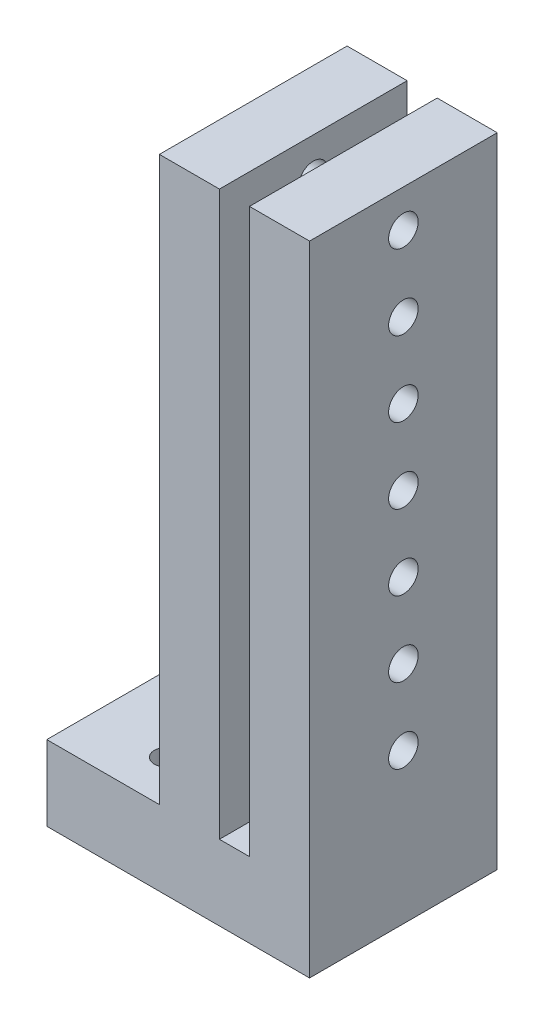
ISO-10303-21;
HEADER;
FILE_DESCRIPTION(('STEP AP214'),'2;1');
FILE_NAME('part.step','',(''),(''),'','','');
FILE_SCHEMA(('AUTOMOTIVE_DESIGN { 1 0 10303 214 1 1 1 1 }'));
ENDSEC;
DATA;
#1=APPLICATION_CONTEXT('core data for automotive mechanical design processes');
#2=APPLICATION_PROTOCOL_DEFINITION('international standard','automotive_design',2000,#1);
#3=PRODUCT_CONTEXT('',#1,'mechanical');
#4=PRODUCT('Part','Part','',(#3));
#5=PRODUCT_RELATED_PRODUCT_CATEGORY('part','',(#4));
#6=PRODUCT_DEFINITION_FORMATION('','',#4);
#7=PRODUCT_DEFINITION_CONTEXT('part definition',#1,'design');
#8=PRODUCT_DEFINITION('design','',#6,#7);
#9=PRODUCT_DEFINITION_SHAPE('','',#8);
#10=(LENGTH_UNIT() NAMED_UNIT(*) SI_UNIT(.MILLI.,.METRE.));
#11=(NAMED_UNIT(*) PLANE_ANGLE_UNIT() SI_UNIT($,.RADIAN.));
#12=(NAMED_UNIT(*) SI_UNIT($,.STERADIAN.) SOLID_ANGLE_UNIT());
#13=UNCERTAINTY_MEASURE_WITH_UNIT(LENGTH_MEASURE(1.E-05),#10,'distance_accuracy_value','');
#14=(GEOMETRIC_REPRESENTATION_CONTEXT(3) GLOBAL_UNCERTAINTY_ASSIGNED_CONTEXT((#13)) GLOBAL_UNIT_ASSIGNED_CONTEXT((#10,
#11,#12)) REPRESENTATION_CONTEXT('',''));
#15=CARTESIAN_POINT('',(0.,0.,0.));
#16=DIRECTION('',(0.,0.,1.));
#17=DIRECTION('',(1.,0.,0.));
#18=AXIS2_PLACEMENT_3D('',#15,#16,#17);
#19=CARTESIAN_POINT('',(50.,20.,-12.5));
#20=DIRECTION('',(-1.,0.,0.));
#21=DIRECTION('',(0.,0.,1.));
#22=AXIS2_PLACEMENT_3D('',#19,#20,#21);
#23=CYLINDRICAL_SURFACE('',#22,1.9669550215581);
#24=CARTESIAN_POINT('',(15.,20.,-12.5));
#25=DIRECTION('',(-1.,0.,0.));
#26=DIRECTION('',(0.,0.,1.));
#27=AXIS2_PLACEMENT_3D('',#24,#25,#26);
#28=CIRCLE('',#27,1.9669550215581);
#29=CARTESIAN_POINT('',(15.,20.,-10.5330449784419));
#30=VERTEX_POINT('',#29);
#31=EDGE_CURVE('E47',#30,#30,#28,.T.);
#32=ORIENTED_EDGE('',*,*,#31,.T.);
#33=EDGE_LOOP('',(#32));
#34=FACE_BOUND('',#33,.T.);
#35=CARTESIAN_POINT('',(23.,20.,-12.5));
#36=DIRECTION('',(-1.,0.,0.));
#37=DIRECTION('',(0.,0.,1.));
#38=AXIS2_PLACEMENT_3D('',#35,#36,#37);
#39=CIRCLE('',#38,1.9669550215581);
#40=CARTESIAN_POINT('',(23.,20.,-10.5330449784419));
#41=VERTEX_POINT('',#40);
#42=EDGE_CURVE('E11',#41,#41,#39,.T.);
#43=ORIENTED_EDGE('',*,*,#42,.F.);
#44=EDGE_LOOP('',(#43));
#45=FACE_BOUND('',#44,.T.);
#46=ADVANCED_FACE('F39',(#34,#45),#23,.F.);
#47=CARTESIAN_POINT('',(50.,30.,-12.5));
#48=DIRECTION('',(-1.,0.,0.));
#49=DIRECTION('',(0.,0.,1.));
#50=AXIS2_PLACEMENT_3D('',#47,#48,#49);
#51=CYLINDRICAL_SURFACE('',#50,1.9669550215581);
#52=CARTESIAN_POINT('',(15.,30.,-12.5));
#53=DIRECTION('',(-1.,0.,0.));
#54=DIRECTION('',(0.,0.,1.));
#55=AXIS2_PLACEMENT_3D('',#52,#53,#54);
#56=CIRCLE('',#55,1.9669550215581);
#57=CARTESIAN_POINT('',(15.,30.,-10.5330449784419));
#58=VERTEX_POINT('',#57);
#59=EDGE_CURVE('E237',#58,#58,#56,.T.);
#60=ORIENTED_EDGE('',*,*,#59,.T.);
#61=EDGE_LOOP('',(#60));
#62=FACE_BOUND('',#61,.T.);
#63=CARTESIAN_POINT('',(23.,30.,-12.5));
#64=DIRECTION('',(-1.,0.,0.));
#65=DIRECTION('',(0.,0.,1.));
#66=AXIS2_PLACEMENT_3D('',#63,#64,#65);
#67=CIRCLE('',#66,1.9669550215581);
#68=CARTESIAN_POINT('',(23.,30.,-10.5330449784419));
#69=VERTEX_POINT('',#68);
#70=EDGE_CURVE('E241',#69,#69,#67,.T.);
#71=ORIENTED_EDGE('',*,*,#70,.F.);
#72=EDGE_LOOP('',(#71));
#73=FACE_BOUND('',#72,.T.);
#74=ADVANCED_FACE('F267',(#62,#73),#51,.F.);
#75=CARTESIAN_POINT('',(50.,40.,-12.5));
#76=DIRECTION('',(-1.,0.,0.));
#77=DIRECTION('',(0.,0.,1.));
#78=AXIS2_PLACEMENT_3D('',#75,#76,#77);
#79=CYLINDRICAL_SURFACE('',#78,1.9669550215581);
#80=CARTESIAN_POINT('',(15.,40.,-12.5));
#81=DIRECTION('',(-1.,0.,0.));
#82=DIRECTION('',(0.,0.,1.));
#83=AXIS2_PLACEMENT_3D('',#80,#81,#82);
#84=CIRCLE('',#83,1.9669550215581);
#85=CARTESIAN_POINT('',(15.,40.,-10.5330449784419));
#86=VERTEX_POINT('',#85);
#87=EDGE_CURVE('E229',#86,#86,#84,.T.);
#88=ORIENTED_EDGE('',*,*,#87,.T.);
#89=EDGE_LOOP('',(#88));
#90=FACE_BOUND('',#89,.T.);
#91=CARTESIAN_POINT('',(23.,40.,-12.5));
#92=DIRECTION('',(-1.,0.,0.));
#93=DIRECTION('',(0.,0.,1.));
#94=AXIS2_PLACEMENT_3D('',#91,#92,#93);
#95=CIRCLE('',#94,1.9669550215581);
#96=CARTESIAN_POINT('',(23.,40.,-10.5330449784419));
#97=VERTEX_POINT('',#96);
#98=EDGE_CURVE('E233',#97,#97,#95,.T.);
#99=ORIENTED_EDGE('',*,*,#98,.F.);
#100=EDGE_LOOP('',(#99));
#101=FACE_BOUND('',#100,.T.);
#102=ADVANCED_FACE('F271',(#90,#101),#79,.F.);
#103=CARTESIAN_POINT('',(50.,50.,-12.5));
#104=DIRECTION('',(-1.,0.,0.));
#105=DIRECTION('',(0.,0.,1.));
#106=AXIS2_PLACEMENT_3D('',#103,#104,#105);
#107=CYLINDRICAL_SURFACE('',#106,1.9669550215581);
#108=CARTESIAN_POINT('',(15.,50.,-12.5));
#109=DIRECTION('',(-1.,0.,0.));
#110=DIRECTION('',(0.,0.,1.));
#111=AXIS2_PLACEMENT_3D('',#108,#109,#110);
#112=CIRCLE('',#111,1.9669550215581);
#113=CARTESIAN_POINT('',(15.,50.,-10.5330449784419));
#114=VERTEX_POINT('',#113);
#115=EDGE_CURVE('E221',#114,#114,#112,.T.);
#116=ORIENTED_EDGE('',*,*,#115,.T.);
#117=EDGE_LOOP('',(#116));
#118=FACE_BOUND('',#117,.T.);
#119=CARTESIAN_POINT('',(23.,50.,-12.5));
#120=DIRECTION('',(-1.,0.,0.));
#121=DIRECTION('',(0.,0.,1.));
#122=AXIS2_PLACEMENT_3D('',#119,#120,#121);
#123=CIRCLE('',#122,1.9669550215581);
#124=CARTESIAN_POINT('',(23.,50.,-10.5330449784419));
#125=VERTEX_POINT('',#124);
#126=EDGE_CURVE('E225',#125,#125,#123,.T.);
#127=ORIENTED_EDGE('',*,*,#126,.F.);
#128=EDGE_LOOP('',(#127));
#129=FACE_BOUND('',#128,.T.);
#130=ADVANCED_FACE('F276',(#118,#129),#107,.F.);
#131=CARTESIAN_POINT('',(50.,60.,-12.5));
#132=DIRECTION('',(-1.,0.,0.));
#133=DIRECTION('',(0.,0.,1.));
#134=AXIS2_PLACEMENT_3D('',#131,#132,#133);
#135=CYLINDRICAL_SURFACE('',#134,1.9669550215581);
#136=CARTESIAN_POINT('',(15.,60.,-12.5));
#137=DIRECTION('',(-1.,0.,0.));
#138=DIRECTION('',(0.,0.,1.));
#139=AXIS2_PLACEMENT_3D('',#136,#137,#138);
#140=CIRCLE('',#139,1.9669550215581);
#141=CARTESIAN_POINT('',(15.,60.,-10.5330449784419));
#142=VERTEX_POINT('',#141);
#143=EDGE_CURVE('E213',#142,#142,#140,.T.);
#144=ORIENTED_EDGE('',*,*,#143,.T.);
#145=EDGE_LOOP('',(#144));
#146=FACE_BOUND('',#145,.T.);
#147=CARTESIAN_POINT('',(23.,60.,-12.5));
#148=DIRECTION('',(-1.,0.,0.));
#149=DIRECTION('',(0.,0.,1.));
#150=AXIS2_PLACEMENT_3D('',#147,#148,#149);
#151=CIRCLE('',#150,1.9669550215581);
#152=CARTESIAN_POINT('',(23.,60.,-10.5330449784419));
#153=VERTEX_POINT('',#152);
#154=EDGE_CURVE('E217',#153,#153,#151,.T.);
#155=ORIENTED_EDGE('',*,*,#154,.F.);
#156=EDGE_LOOP('',(#155));
#157=FACE_BOUND('',#156,.T.);
#158=ADVANCED_FACE('F283',(#146,#157),#135,.F.);
#159=CARTESIAN_POINT('',(50.,20.,-12.5));
#160=DIRECTION('',(-1.,0.,0.));
#161=DIRECTION('',(0.,0.,1.));
#162=AXIS2_PLACEMENT_3D('',#159,#160,#161);
#163=CYLINDRICAL_SURFACE('',#162,1.9669550215581);
#164=CARTESIAN_POINT('',(27.,20.,-12.5));
#165=DIRECTION('',(1.,0.,0.));
#166=DIRECTION('',(0.,0.,-1.));
#167=AXIS2_PLACEMENT_3D('',#164,#165,#166);
#168=CIRCLE('',#167,1.9669550215581);
#169=CARTESIAN_POINT('',(27.,20.,-14.4669550215581));
#170=VERTEX_POINT('',#169);
#171=EDGE_CURVE('E205',#170,#170,#168,.T.);
#172=ORIENTED_EDGE('',*,*,#171,.F.);
#173=EDGE_LOOP('',(#172));
#174=FACE_BOUND('',#173,.T.);
#175=CARTESIAN_POINT('',(35.,20.,-12.5));
#176=DIRECTION('',(-1.,0.,0.));
#177=DIRECTION('',(0.,0.,1.));
#178=AXIS2_PLACEMENT_3D('',#175,#176,#177);
#179=CIRCLE('',#178,1.9669550215581);
#180=CARTESIAN_POINT('',(35.,20.,-10.5330449784419));
#181=VERTEX_POINT('',#180);
#182=EDGE_CURVE('E209',#181,#181,#179,.T.);
#183=ORIENTED_EDGE('',*,*,#182,.F.);
#184=EDGE_LOOP('',(#183));
#185=FACE_BOUND('',#184,.T.);
#186=ADVANCED_FACE('F287',(#174,#185),#163,.F.);
#187=CARTESIAN_POINT('',(50.,30.,-12.5));
#188=DIRECTION('',(-1.,0.,0.));
#189=DIRECTION('',(0.,0.,1.));
#190=AXIS2_PLACEMENT_3D('',#187,#188,#189);
#191=CYLINDRICAL_SURFACE('',#190,1.9669550215581);
#192=CARTESIAN_POINT('',(27.,30.,-12.5));
#193=DIRECTION('',(1.,0.,0.));
#194=DIRECTION('',(0.,0.,-1.));
#195=AXIS2_PLACEMENT_3D('',#192,#193,#194);
#196=CIRCLE('',#195,1.9669550215581);
#197=CARTESIAN_POINT('',(27.,30.,-14.4669550215581));
#198=VERTEX_POINT('',#197);
#199=EDGE_CURVE('E197',#198,#198,#196,.T.);
#200=ORIENTED_EDGE('',*,*,#199,.F.);
#201=EDGE_LOOP('',(#200));
#202=FACE_BOUND('',#201,.T.);
#203=CARTESIAN_POINT('',(35.,30.,-12.5));
#204=DIRECTION('',(-1.,0.,0.));
#205=DIRECTION('',(0.,0.,1.));
#206=AXIS2_PLACEMENT_3D('',#203,#204,#205);
#207=CIRCLE('',#206,1.9669550215581);
#208=CARTESIAN_POINT('',(35.,30.,-10.5330449784419));
#209=VERTEX_POINT('',#208);
#210=EDGE_CURVE('E201',#209,#209,#207,.T.);
#211=ORIENTED_EDGE('',*,*,#210,.F.);
#212=EDGE_LOOP('',(#211));
#213=FACE_BOUND('',#212,.T.);
#214=ADVANCED_FACE('F291',(#202,#213),#191,.F.);
#215=CARTESIAN_POINT('',(50.,40.,-12.5));
#216=DIRECTION('',(-1.,0.,0.));
#217=DIRECTION('',(0.,0.,1.));
#218=AXIS2_PLACEMENT_3D('',#215,#216,#217);
#219=CYLINDRICAL_SURFACE('',#218,1.9669550215581);
#220=CARTESIAN_POINT('',(27.,40.,-12.5));
#221=DIRECTION('',(1.,0.,0.));
#222=DIRECTION('',(0.,0.,-1.));
#223=AXIS2_PLACEMENT_3D('',#220,#221,#222);
#224=CIRCLE('',#223,1.9669550215581);
#225=CARTESIAN_POINT('',(27.,40.,-14.4669550215581));
#226=VERTEX_POINT('',#225);
#227=EDGE_CURVE('E189',#226,#226,#224,.T.);
#228=ORIENTED_EDGE('',*,*,#227,.F.);
#229=EDGE_LOOP('',(#228));
#230=FACE_BOUND('',#229,.T.);
#231=CARTESIAN_POINT('',(35.,40.,-12.5));
#232=DIRECTION('',(-1.,0.,0.));
#233=DIRECTION('',(0.,0.,1.));
#234=AXIS2_PLACEMENT_3D('',#231,#232,#233);
#235=CIRCLE('',#234,1.9669550215581);
#236=CARTESIAN_POINT('',(35.,40.,-10.5330449784419));
#237=VERTEX_POINT('',#236);
#238=EDGE_CURVE('E193',#237,#237,#235,.T.);
#239=ORIENTED_EDGE('',*,*,#238,.F.);
#240=EDGE_LOOP('',(#239));
#241=FACE_BOUND('',#240,.T.);
#242=ADVANCED_FACE('F295',(#230,#241),#219,.F.);
#243=CARTESIAN_POINT('',(50.,50.,-12.5));
#244=DIRECTION('',(-1.,0.,0.));
#245=DIRECTION('',(0.,0.,1.));
#246=AXIS2_PLACEMENT_3D('',#243,#244,#245);
#247=CYLINDRICAL_SURFACE('',#246,1.9669550215581);
#248=CARTESIAN_POINT('',(27.,50.,-12.5));
#249=DIRECTION('',(1.,0.,0.));
#250=DIRECTION('',(0.,0.,-1.));
#251=AXIS2_PLACEMENT_3D('',#248,#249,#250);
#252=CIRCLE('',#251,1.9669550215581);
#253=CARTESIAN_POINT('',(27.,50.,-14.4669550215581));
#254=VERTEX_POINT('',#253);
#255=EDGE_CURVE('E181',#254,#254,#252,.T.);
#256=ORIENTED_EDGE('',*,*,#255,.F.);
#257=EDGE_LOOP('',(#256));
#258=FACE_BOUND('',#257,.T.);
#259=CARTESIAN_POINT('',(35.,50.,-12.5));
#260=DIRECTION('',(-1.,0.,0.));
#261=DIRECTION('',(0.,0.,1.));
#262=AXIS2_PLACEMENT_3D('',#259,#260,#261);
#263=CIRCLE('',#262,1.9669550215581);
#264=CARTESIAN_POINT('',(35.,50.,-10.5330449784419));
#265=VERTEX_POINT('',#264);
#266=EDGE_CURVE('E185',#265,#265,#263,.T.);
#267=ORIENTED_EDGE('',*,*,#266,.F.);
#268=EDGE_LOOP('',(#267));
#269=FACE_BOUND('',#268,.T.);
#270=ADVANCED_FACE('F299',(#258,#269),#247,.F.);
#271=CARTESIAN_POINT('',(50.,60.,-12.5));
#272=DIRECTION('',(-1.,0.,0.));
#273=DIRECTION('',(0.,0.,1.));
#274=AXIS2_PLACEMENT_3D('',#271,#272,#273);
#275=CYLINDRICAL_SURFACE('',#274,1.9669550215581);
#276=CARTESIAN_POINT('',(27.,60.,-12.5));
#277=DIRECTION('',(1.,0.,0.));
#278=DIRECTION('',(0.,0.,-1.));
#279=AXIS2_PLACEMENT_3D('',#276,#277,#278);
#280=CIRCLE('',#279,1.9669550215581);
#281=CARTESIAN_POINT('',(27.,60.,-14.4669550215581));
#282=VERTEX_POINT('',#281);
#283=EDGE_CURVE('E167',#282,#282,#280,.T.);
#284=ORIENTED_EDGE('',*,*,#283,.F.);
#285=EDGE_LOOP('',(#284));
#286=FACE_BOUND('',#285,.T.);
#287=CARTESIAN_POINT('',(35.,60.,-12.5));
#288=DIRECTION('',(-1.,0.,0.));
#289=DIRECTION('',(0.,0.,1.));
#290=AXIS2_PLACEMENT_3D('',#287,#288,#289);
#291=CIRCLE('',#290,1.9669550215581);
#292=CARTESIAN_POINT('',(35.,60.,-10.5330449784419));
#293=VERTEX_POINT('',#292);
#294=EDGE_CURVE('E177',#293,#293,#291,.T.);
#295=ORIENTED_EDGE('',*,*,#294,.F.);
#296=EDGE_LOOP('',(#295));
#297=FACE_BOUND('',#296,.T.);
#298=ADVANCED_FACE('F303',(#286,#297),#275,.F.);
#299=CARTESIAN_POINT('',(0.,85.,0.));
#300=DIRECTION('',(0.,1.,0.));
#301=DIRECTION('',(0.,0.,1.));
#302=AXIS2_PLACEMENT_3D('',#299,#300,#301);
#303=PLANE('',#302);
#304=DIRECTION('',(0.,0.,-1.));
#305=VECTOR('',#304,1.);
#306=CARTESIAN_POINT('',(27.,85.,-25.));
#307=LINE('',#306,#305);
#308=CARTESIAN_POINT('',(27.,85.,0.));
#309=VERTEX_POINT('',#308);
#310=CARTESIAN_POINT('',(27.,85.,-25.));
#311=VERTEX_POINT('',#310);
#312=EDGE_CURVE('E367',#309,#311,#307,.T.);
#313=ORIENTED_EDGE('',*,*,#312,.F.);
#314=DIRECTION('',(1.,0.,0.));
#315=VECTOR('',#314,1.);
#316=CARTESIAN_POINT('',(15.,85.,0.));
#317=LINE('',#316,#315);
#318=CARTESIAN_POINT('',(35.,85.,0.));
#319=VERTEX_POINT('',#318);
#320=EDGE_CURVE('E403',#309,#319,#317,.T.);
#321=ORIENTED_EDGE('',*,*,#320,.T.);
#322=DIRECTION('',(0.,0.,-1.));
#323=VECTOR('',#322,1.);
#324=CARTESIAN_POINT('',(35.,85.,-25.));
#325=LINE('',#324,#323);
#326=CARTESIAN_POINT('',(35.,85.,-25.));
#327=VERTEX_POINT('',#326);
#328=EDGE_CURVE('E408',#319,#327,#325,.T.);
#329=ORIENTED_EDGE('',*,*,#328,.T.);
#330=DIRECTION('',(-1.,0.,0.));
#331=VECTOR('',#330,1.);
#332=CARTESIAN_POINT('',(15.,85.,-25.));
#333=LINE('',#332,#331);
#334=EDGE_CURVE('E125',#327,#311,#333,.T.);
#335=ORIENTED_EDGE('',*,*,#334,.T.);
#336=EDGE_LOOP('',(#313,#321,#329,#335));
#337=FACE_BOUND('',#336,.T.);
#338=ADVANCED_FACE('F307',(#337),#303,.T.);
#339=CARTESIAN_POINT('',(0.,10.,0.));
#340=DIRECTION('',(0.,-1.,0.));
#341=DIRECTION('',(0.,0.,-1.));
#342=AXIS2_PLACEMENT_3D('',#339,#340,#341);
#343=PLANE('',#342);
#344=CARTESIAN_POINT('',(10.0004400064535,9.99999999999999,-5.93063091270837));
#345=DIRECTION('',(0.,-1.,0.));
#346=DIRECTION('',(0.,0.,-1.));
#347=AXIS2_PLACEMENT_3D('',#344,#345,#346);
#348=CIRCLE('',#347,1.6);
#349=CARTESIAN_POINT('',(10.0004400064535,9.99999999999999,-7.53063091270837));
#350=VERTEX_POINT('',#349);
#351=EDGE_CURVE('E329',#350,#350,#348,.F.);
#352=ORIENTED_EDGE('',*,*,#351,.F.);
#353=EDGE_LOOP('',(#352));
#354=FACE_BOUND('',#353,.T.);
#355=CARTESIAN_POINT('',(10.0004400064535,9.99999999999999,-19.0693690872916));
#356=DIRECTION('',(0.,-1.,0.));
#357=DIRECTION('',(0.,0.,-1.));
#358=AXIS2_PLACEMENT_3D('',#355,#356,#357);
#359=CIRCLE('',#358,1.6);
#360=CARTESIAN_POINT('',(10.0004400064535,9.99999999999999,-20.6693690872916));
#361=VERTEX_POINT('',#360);
#362=EDGE_CURVE('E141',#361,#361,#359,.T.);
#363=ORIENTED_EDGE('',*,*,#362,.T.);
#364=EDGE_LOOP('',(#363));
#365=FACE_BOUND('',#364,.T.);
#366=DIRECTION('',(0.,0.,1.));
#367=VECTOR('',#366,1.);
#368=CARTESIAN_POINT('',(15.,10.,-25.));
#369=LINE('',#368,#367);
#370=CARTESIAN_POINT('',(15.,10.,-25.));
#371=VERTEX_POINT('',#370);
#372=CARTESIAN_POINT('',(15.,10.,0.));
#373=VERTEX_POINT('',#372);
#374=EDGE_CURVE('E62',#371,#373,#369,.T.);
#375=ORIENTED_EDGE('',*,*,#374,.F.);
#376=DIRECTION('',(-1.,0.,0.));
#377=VECTOR('',#376,1.);
#378=CARTESIAN_POINT('',(0.,10.,-25.));
#379=LINE('',#378,#377);
#380=CARTESIAN_POINT('',(0.,10.,-25.));
#381=VERTEX_POINT('',#380);
#382=EDGE_CURVE('E163',#371,#381,#379,.T.);
#383=ORIENTED_EDGE('',*,*,#382,.T.);
#384=DIRECTION('',(0.,0.,1.));
#385=VECTOR('',#384,1.);
#386=CARTESIAN_POINT('',(0.,10.,0.));
#387=LINE('',#386,#385);
#388=CARTESIAN_POINT('',(0.,10.,0.));
#389=VERTEX_POINT('',#388);
#390=EDGE_CURVE('E148',#381,#389,#387,.T.);
#391=ORIENTED_EDGE('',*,*,#390,.T.);
#392=DIRECTION('',(1.,0.,0.));
#393=VECTOR('',#392,1.);
#394=CARTESIAN_POINT('',(0.,10.,0.));
#395=LINE('',#394,#393);
#396=EDGE_CURVE('E154',#389,#373,#395,.T.);
#397=ORIENTED_EDGE('',*,*,#396,.T.);
#398=EDGE_LOOP('',(#375,#383,#391,#397));
#399=FACE_BOUND('',#398,.T.);
#400=ADVANCED_FACE('F313',(#354,#365,#399),#343,.F.);
#401=CARTESIAN_POINT('',(0.,10.,0.));
#402=DIRECTION('',(1.,0.,0.));
#403=DIRECTION('',(0.,0.,-1.));
#404=AXIS2_PLACEMENT_3D('',#401,#402,#403);
#405=PLANE('',#404);
#406=DIRECTION('',(0.,0.,1.));
#407=VECTOR('',#406,1.);
#408=CARTESIAN_POINT('',(0.,0.,0.));
#409=LINE('',#408,#407);
#410=CARTESIAN_POINT('',(0.,0.,-25.));
#411=VERTEX_POINT('',#410);
#412=CARTESIAN_POINT('',(0.,0.,0.));
#413=VERTEX_POINT('',#412);
#414=EDGE_CURVE('E146',#411,#413,#409,.T.);
#415=ORIENTED_EDGE('',*,*,#414,.T.);
#416=DIRECTION('',(0.,-1.,0.));
#417=VECTOR('',#416,1.);
#418=CARTESIAN_POINT('',(0.,10.,0.));
#419=LINE('',#418,#417);
#420=EDGE_CURVE('E162',#389,#413,#419,.T.);
#421=ORIENTED_EDGE('',*,*,#420,.F.);
#422=ORIENTED_EDGE('',*,*,#390,.F.);
#423=DIRECTION('',(0.,-1.,0.));
#424=VECTOR('',#423,1.);
#425=CARTESIAN_POINT('',(0.,10.,-25.));
#426=LINE('',#425,#424);
#427=EDGE_CURVE('E159',#381,#411,#426,.T.);
#428=ORIENTED_EDGE('',*,*,#427,.T.);
#429=EDGE_LOOP('',(#415,#421,#422,#428));
#430=FACE_BOUND('',#429,.T.);
#431=ADVANCED_FACE('F309',(#430),#405,.F.);
#432=CARTESIAN_POINT('',(0.,10.,0.));
#433=DIRECTION('',(0.,0.,-1.));
#434=DIRECTION('',(-1.,0.,0.));
#435=AXIS2_PLACEMENT_3D('',#432,#433,#434);
#436=PLANE('',#435);
#437=DIRECTION('',(1.,0.,0.));
#438=VECTOR('',#437,1.);
#439=CARTESIAN_POINT('',(0.,0.,0.));
#440=LINE('',#439,#438);
#441=CARTESIAN_POINT('',(35.,0.,0.));
#442=VERTEX_POINT('',#441);
#443=EDGE_CURVE('E149',#413,#442,#440,.T.);
#444=ORIENTED_EDGE('',*,*,#443,.T.);
#445=DIRECTION('',(0.,-1.,0.));
#446=VECTOR('',#445,1.);
#447=CARTESIAN_POINT('',(35.,85.,0.));
#448=LINE('',#447,#446);
#449=EDGE_CURVE('E129',#319,#442,#448,.T.);
#450=ORIENTED_EDGE('',*,*,#449,.F.);
#451=ORIENTED_EDGE('',*,*,#320,.F.);
#452=DIRECTION('',(0.,1.,0.));
#453=VECTOR('',#452,1.);
#454=CARTESIAN_POINT('',(27.,-15.3179778023443,0.));
#455=LINE('',#454,#453);
#456=CARTESIAN_POINT('',(27.,10.,0.));
#457=VERTEX_POINT('',#456);
#458=EDGE_CURVE('E376',#457,#309,#455,.T.);
#459=ORIENTED_EDGE('',*,*,#458,.F.);
#460=DIRECTION('',(1.,0.,0.));
#461=VECTOR('',#460,1.);
#462=CARTESIAN_POINT('',(23.,10.,0.));
#463=LINE('',#462,#461);
#464=CARTESIAN_POINT('',(23.,10.,0.));
#465=VERTEX_POINT('',#464);
#466=EDGE_CURVE('E370',#465,#457,#463,.T.);
#467=ORIENTED_EDGE('',*,*,#466,.F.);
#468=DIRECTION('',(0.,1.,0.));
#469=VECTOR('',#468,1.);
#470=CARTESIAN_POINT('',(23.,-15.3179778023443,0.));
#471=LINE('',#470,#469);
#472=CARTESIAN_POINT('',(23.,85.,0.));
#473=VERTEX_POINT('',#472);
#474=EDGE_CURVE('E380',#465,#473,#471,.T.);
#475=ORIENTED_EDGE('',*,*,#474,.T.);
#476=CARTESIAN_POINT('',(15.,85.,0.));
#477=VERTEX_POINT('',#476);
#478=EDGE_CURVE('E404',#477,#473,#317,.T.);
#479=ORIENTED_EDGE('',*,*,#478,.F.);
#480=DIRECTION('',(0.,-1.,0.));
#481=VECTOR('',#480,1.);
#482=CARTESIAN_POINT('',(15.,85.,0.));
#483=LINE('',#482,#481);
#484=EDGE_CURVE('E421',#477,#373,#483,.T.);
#485=ORIENTED_EDGE('',*,*,#484,.T.);
#486=ORIENTED_EDGE('',*,*,#396,.F.);
#487=ORIENTED_EDGE('',*,*,#420,.T.);
#488=EDGE_LOOP('',(#444,#450,#451,#459,#467,#475,#479,#485,#486,#487));
#489=FACE_BOUND('',#488,.T.);
#490=ADVANCED_FACE('F312',(#489),#436,.F.);
#491=CARTESIAN_POINT('',(0.,10.,-25.));
#492=DIRECTION('',(0.,0.,1.));
#493=DIRECTION('',(1.,0.,0.));
#494=AXIS2_PLACEMENT_3D('',#491,#492,#493);
#495=PLANE('',#494);
#496=DIRECTION('',(0.,-1.,0.));
#497=VECTOR('',#496,1.);
#498=CARTESIAN_POINT('',(35.,85.,-25.));
#499=LINE('',#498,#497);
#500=CARTESIAN_POINT('',(35.,0.,-25.));
#501=VERTEX_POINT('',#500);
#502=EDGE_CURVE('E116',#327,#501,#499,.T.);
#503=ORIENTED_EDGE('',*,*,#502,.T.);
#504=DIRECTION('',(-1.,0.,0.));
#505=VECTOR('',#504,1.);
#506=CARTESIAN_POINT('',(0.,0.,-25.));
#507=LINE('',#506,#505);
#508=EDGE_CURVE('E121',#501,#411,#507,.T.);
#509=ORIENTED_EDGE('',*,*,#508,.T.);
#510=ORIENTED_EDGE('',*,*,#427,.F.);
#511=ORIENTED_EDGE('',*,*,#382,.F.);
#512=DIRECTION('',(0.,-1.,0.));
#513=VECTOR('',#512,1.);
#514=CARTESIAN_POINT('',(15.,85.,-25.));
#515=LINE('',#514,#513);
#516=CARTESIAN_POINT('',(15.,85.,-25.));
#517=VERTEX_POINT('',#516);
#518=EDGE_CURVE('E130',#517,#371,#515,.T.);
#519=ORIENTED_EDGE('',*,*,#518,.F.);
#520=CARTESIAN_POINT('',(23.,85.,-25.));
#521=VERTEX_POINT('',#520);
#522=EDGE_CURVE('E411',#521,#517,#333,.T.);
#523=ORIENTED_EDGE('',*,*,#522,.F.);
#524=DIRECTION('',(0.,1.,0.));
#525=VECTOR('',#524,1.);
#526=CARTESIAN_POINT('',(23.,-15.3179778023443,-25.));
#527=LINE('',#526,#525);
#528=CARTESIAN_POINT('',(23.,10.,-25.));
#529=VERTEX_POINT('',#528);
#530=EDGE_CURVE('E54',#529,#521,#527,.T.);
#531=ORIENTED_EDGE('',*,*,#530,.F.);
#532=DIRECTION('',(-1.,0.,0.));
#533=VECTOR('',#532,1.);
#534=CARTESIAN_POINT('',(23.,10.,-25.));
#535=LINE('',#534,#533);
#536=CARTESIAN_POINT('',(27.,10.,-25.));
#537=VERTEX_POINT('',#536);
#538=EDGE_CURVE('E381',#537,#529,#535,.T.);
#539=ORIENTED_EDGE('',*,*,#538,.F.);
#540=DIRECTION('',(0.,1.,0.));
#541=VECTOR('',#540,1.);
#542=CARTESIAN_POINT('',(27.,-15.3179778023443,-25.));
#543=LINE('',#542,#541);
#544=EDGE_CURVE('E385',#537,#311,#543,.T.);
#545=ORIENTED_EDGE('',*,*,#544,.T.);
#546=ORIENTED_EDGE('',*,*,#334,.F.);
#547=EDGE_LOOP('',(#503,#509,#510,#511,#519,#523,#531,#539,#545,#546));
#548=FACE_BOUND('',#547,.T.);
#549=ADVANCED_FACE('F118',(#548),#495,.F.);
#550=CARTESIAN_POINT('',(0.,0.,0.));
#551=DIRECTION('',(0.,-1.,0.));
#552=DIRECTION('',(0.,0.,-1.));
#553=AXIS2_PLACEMENT_3D('',#550,#551,#552);
#554=PLANE('',#553);
#555=CARTESIAN_POINT('',(10.0004400064535,0.,-5.93063091270837));
#556=DIRECTION('',(0.,1.,0.));
#557=DIRECTION('',(0.,0.,1.));
#558=AXIS2_PLACEMENT_3D('',#555,#556,#557);
#559=CIRCLE('',#558,1.6);
#560=CARTESIAN_POINT('',(10.0004400064535,0.,-4.33063091270836));
#561=VERTEX_POINT('',#560);
#562=EDGE_CURVE('E662',#561,#561,#559,.T.);
#563=ORIENTED_EDGE('',*,*,#562,.T.);
#564=EDGE_LOOP('',(#563));
#565=FACE_BOUND('',#564,.T.);
#566=CARTESIAN_POINT('',(10.0004400064535,0.,-19.0693690872916));
#567=DIRECTION('',(0.,-1.,0.));
#568=DIRECTION('',(0.,0.,-1.));
#569=AXIS2_PLACEMENT_3D('',#566,#567,#568);
#570=CIRCLE('',#569,1.6);
#571=CARTESIAN_POINT('',(10.0004400064535,0.,-20.6693690872916));
#572=VERTEX_POINT('',#571);
#573=EDGE_CURVE('E334',#572,#572,#570,.T.);
#574=ORIENTED_EDGE('',*,*,#573,.F.);
#575=EDGE_LOOP('',(#574));
#576=FACE_BOUND('',#575,.T.);
#577=DIRECTION('',(0.,0.,1.));
#578=VECTOR('',#577,1.);
#579=CARTESIAN_POINT('',(35.,0.,-25.));
#580=LINE('',#579,#578);
#581=EDGE_CURVE('E133',#501,#442,#580,.T.);
#582=ORIENTED_EDGE('',*,*,#581,.T.);
#583=ORIENTED_EDGE('',*,*,#443,.F.);
#584=ORIENTED_EDGE('',*,*,#414,.F.);
#585=ORIENTED_EDGE('',*,*,#508,.F.);
#586=EDGE_LOOP('',(#582,#583,#584,#585));
#587=FACE_BOUND('',#586,.T.);
#588=ADVANCED_FACE('F144',(#565,#576,#587),#554,.T.);
#589=CARTESIAN_POINT('',(15.,85.,-25.));
#590=DIRECTION('',(1.,0.,0.));
#591=DIRECTION('',(0.,0.,-1.));
#592=AXIS2_PLACEMENT_3D('',#589,#590,#591);
#593=PLANE('',#592);
#594=CARTESIAN_POINT('',(15.,70.,-12.5));
#595=DIRECTION('',(-1.,0.,0.));
#596=DIRECTION('',(0.,0.,1.));
#597=AXIS2_PLACEMENT_3D('',#594,#595,#596);
#598=CIRCLE('',#597,1.9669550215581);
#599=CARTESIAN_POINT('',(15.,70.,-10.5330449784419));
#600=VERTEX_POINT('',#599);
#601=EDGE_CURVE('E140',#600,#600,#598,.T.);
#602=ORIENTED_EDGE('',*,*,#601,.F.);
#603=EDGE_LOOP('',(#602));
#604=FACE_BOUND('',#603,.T.);
#605=CARTESIAN_POINT('',(15.,80.,-12.5));
#606=DIRECTION('',(-1.,0.,0.));
#607=DIRECTION('',(0.,0.,1.));
#608=AXIS2_PLACEMENT_3D('',#605,#606,#607);
#609=CIRCLE('',#608,1.9669550215581);
#610=CARTESIAN_POINT('',(15.,80.,-10.5330449784419));
#611=VERTEX_POINT('',#610);
#612=EDGE_CURVE('E173',#611,#611,#609,.T.);
#613=ORIENTED_EDGE('',*,*,#612,.F.);
#614=EDGE_LOOP('',(#613));
#615=FACE_BOUND('',#614,.T.);
#616=ORIENTED_EDGE('',*,*,#374,.T.);
#617=ORIENTED_EDGE('',*,*,#484,.F.);
#618=DIRECTION('',(0.,0.,1.));
#619=VECTOR('',#618,1.);
#620=CARTESIAN_POINT('',(15.,85.,-25.));
#621=LINE('',#620,#619);
#622=EDGE_CURVE('E399',#517,#477,#621,.T.);
#623=ORIENTED_EDGE('',*,*,#622,.F.);
#624=ORIENTED_EDGE('',*,*,#518,.T.);
#625=EDGE_LOOP('',(#616,#617,#623,#624));
#626=FACE_BOUND('',#625,.T.);
#627=ORIENTED_EDGE('',*,*,#143,.F.);
#628=EDGE_LOOP('',(#627));
#629=FACE_BOUND('',#628,.T.);
#630=ORIENTED_EDGE('',*,*,#115,.F.);
#631=EDGE_LOOP('',(#630));
#632=FACE_BOUND('',#631,.T.);
#633=ORIENTED_EDGE('',*,*,#87,.F.);
#634=EDGE_LOOP('',(#633));
#635=FACE_BOUND('',#634,.T.);
#636=ORIENTED_EDGE('',*,*,#59,.F.);
#637=EDGE_LOOP('',(#636));
#638=FACE_BOUND('',#637,.T.);
#639=ORIENTED_EDGE('',*,*,#31,.F.);
#640=EDGE_LOOP('',(#639));
#641=FACE_BOUND('',#640,.T.);
#642=ADVANCED_FACE('F250',(#604,#615,#626,#629,#632,#635,#638,#641),#593,.F.);
#643=CARTESIAN_POINT('',(35.,85.,-25.));
#644=DIRECTION('',(-1.,0.,0.));
#645=DIRECTION('',(0.,0.,1.));
#646=AXIS2_PLACEMENT_3D('',#643,#644,#645);
#647=PLANE('',#646);
#648=CARTESIAN_POINT('',(35.,70.,-12.5));
#649=DIRECTION('',(-1.,0.,0.));
#650=DIRECTION('',(0.,0.,1.));
#651=AXIS2_PLACEMENT_3D('',#648,#649,#650);
#652=CIRCLE('',#651,1.9669550215581);
#653=CARTESIAN_POINT('',(35.,70.,-10.5330449784419));
#654=VERTEX_POINT('',#653);
#655=EDGE_CURVE('E352',#654,#654,#652,.T.);
#656=ORIENTED_EDGE('',*,*,#655,.T.);
#657=EDGE_LOOP('',(#656));
#658=FACE_BOUND('',#657,.T.);
#659=CARTESIAN_POINT('',(35.,80.,-12.5));
#660=DIRECTION('',(-1.,0.,0.));
#661=DIRECTION('',(0.,0.,1.));
#662=AXIS2_PLACEMENT_3D('',#659,#660,#661);
#663=CIRCLE('',#662,1.9669550215581);
#664=CARTESIAN_POINT('',(35.,80.,-10.5330449784419));
#665=VERTEX_POINT('',#664);
#666=EDGE_CURVE('E362',#665,#665,#663,.T.);
#667=ORIENTED_EDGE('',*,*,#666,.T.);
#668=EDGE_LOOP('',(#667));
#669=FACE_BOUND('',#668,.T.);
#670=ORIENTED_EDGE('',*,*,#449,.T.);
#671=ORIENTED_EDGE('',*,*,#581,.F.);
#672=ORIENTED_EDGE('',*,*,#502,.F.);
#673=ORIENTED_EDGE('',*,*,#328,.F.);
#674=EDGE_LOOP('',(#670,#671,#672,#673));
#675=FACE_BOUND('',#674,.T.);
#676=ORIENTED_EDGE('',*,*,#294,.T.);
#677=EDGE_LOOP('',(#676));
#678=FACE_BOUND('',#677,.T.);
#679=ORIENTED_EDGE('',*,*,#266,.T.);
#680=EDGE_LOOP('',(#679));
#681=FACE_BOUND('',#680,.T.);
#682=ORIENTED_EDGE('',*,*,#238,.T.);
#683=EDGE_LOOP('',(#682));
#684=FACE_BOUND('',#683,.T.);
#685=ORIENTED_EDGE('',*,*,#210,.T.);
#686=EDGE_LOOP('',(#685));
#687=FACE_BOUND('',#686,.T.);
#688=ORIENTED_EDGE('',*,*,#182,.T.);
#689=EDGE_LOOP('',(#688));
#690=FACE_BOUND('',#689,.T.);
#691=ADVANCED_FACE('F134',(#658,#669,#675,#678,#681,#684,#687,#690),#647,.F.);
#692=DIRECTION('',(0.,0.,1.));
#693=VECTOR('',#692,1.);
#694=CARTESIAN_POINT('',(23.,85.,-25.));
#695=LINE('',#694,#693);
#696=EDGE_CURVE('E366',#521,#473,#695,.T.);
#697=ORIENTED_EDGE('',*,*,#696,.F.);
#698=ORIENTED_EDGE('',*,*,#522,.T.);
#699=ORIENTED_EDGE('',*,*,#622,.T.);
#700=ORIENTED_EDGE('',*,*,#478,.T.);
#701=EDGE_LOOP('',(#697,#698,#699,#700));
#702=FACE_BOUND('',#701,.T.);
#703=ADVANCED_FACE('F258',(#702),#303,.T.);
#704=CARTESIAN_POINT('',(0.,10.,0.));
#705=DIRECTION('',(0.,-1.,0.));
#706=DIRECTION('',(0.,0.,-1.));
#707=AXIS2_PLACEMENT_3D('',#704,#705,#706);
#708=PLANE('',#707);
#709=DIRECTION('',(0.,0.,1.));
#710=VECTOR('',#709,1.);
#711=CARTESIAN_POINT('',(23.,10.,-25.));
#712=LINE('',#711,#710);
#713=EDGE_CURVE('E377',#529,#465,#712,.T.);
#714=ORIENTED_EDGE('',*,*,#713,.T.);
#715=ORIENTED_EDGE('',*,*,#466,.T.);
#716=DIRECTION('',(0.,0.,-1.));
#717=VECTOR('',#716,1.);
#718=CARTESIAN_POINT('',(27.,10.,-25.));
#719=LINE('',#718,#717);
#720=EDGE_CURVE('E386',#457,#537,#719,.T.);
#721=ORIENTED_EDGE('',*,*,#720,.T.);
#722=ORIENTED_EDGE('',*,*,#538,.T.);
#723=EDGE_LOOP('',(#714,#715,#721,#722));
#724=FACE_BOUND('',#723,.T.);
#725=ADVANCED_FACE('F449',(#724),#708,.F.);
#726=CARTESIAN_POINT('',(27.,-15.3179778023443,-25.));
#727=DIRECTION('',(1.,0.,0.));
#728=DIRECTION('',(0.,0.,-1.));
#729=AXIS2_PLACEMENT_3D('',#726,#727,#728);
#730=PLANE('',#729);
#731=CARTESIAN_POINT('',(27.,70.,-12.5));
#732=DIRECTION('',(1.,0.,0.));
#733=DIRECTION('',(0.,0.,-1.));
#734=AXIS2_PLACEMENT_3D('',#731,#732,#733);
#735=CIRCLE('',#734,1.9669550215581);
#736=CARTESIAN_POINT('',(27.,70.,-14.4669550215581));
#737=VERTEX_POINT('',#736);
#738=EDGE_CURVE('E348',#737,#737,#735,.T.);
#739=ORIENTED_EDGE('',*,*,#738,.T.);
#740=EDGE_LOOP('',(#739));
#741=FACE_BOUND('',#740,.T.);
#742=CARTESIAN_POINT('',(27.,80.,-12.5));
#743=DIRECTION('',(1.,0.,0.));
#744=DIRECTION('',(0.,0.,-1.));
#745=AXIS2_PLACEMENT_3D('',#742,#743,#744);
#746=CIRCLE('',#745,1.9669550215581);
#747=CARTESIAN_POINT('',(27.,80.,-14.4669550215581));
#748=VERTEX_POINT('',#747);
#749=EDGE_CURVE('E172',#748,#748,#746,.T.);
#750=ORIENTED_EDGE('',*,*,#749,.T.);
#751=EDGE_LOOP('',(#750));
#752=FACE_BOUND('',#751,.T.);
#753=ORIENTED_EDGE('',*,*,#458,.T.);
#754=ORIENTED_EDGE('',*,*,#312,.T.);
#755=ORIENTED_EDGE('',*,*,#544,.F.);
#756=ORIENTED_EDGE('',*,*,#720,.F.);
#757=EDGE_LOOP('',(#753,#754,#755,#756));
#758=FACE_BOUND('',#757,.T.);
#759=ORIENTED_EDGE('',*,*,#283,.T.);
#760=EDGE_LOOP('',(#759));
#761=FACE_BOUND('',#760,.T.);
#762=ORIENTED_EDGE('',*,*,#255,.T.);
#763=EDGE_LOOP('',(#762));
#764=FACE_BOUND('',#763,.T.);
#765=ORIENTED_EDGE('',*,*,#227,.T.);
#766=EDGE_LOOP('',(#765));
#767=FACE_BOUND('',#766,.T.);
#768=ORIENTED_EDGE('',*,*,#199,.T.);
#769=EDGE_LOOP('',(#768));
#770=FACE_BOUND('',#769,.T.);
#771=ORIENTED_EDGE('',*,*,#171,.T.);
#772=EDGE_LOOP('',(#771));
#773=FACE_BOUND('',#772,.T.);
#774=ADVANCED_FACE('F451',(#741,#752,#758,#761,#764,#767,#770,#773),#730,.F.);
#775=CARTESIAN_POINT('',(23.,-15.3179778023443,-25.));
#776=DIRECTION('',(-1.,0.,0.));
#777=DIRECTION('',(0.,0.,1.));
#778=AXIS2_PLACEMENT_3D('',#775,#776,#777);
#779=PLANE('',#778);
#780=CARTESIAN_POINT('',(23.,70.,-12.5));
#781=DIRECTION('',(-1.,0.,0.));
#782=DIRECTION('',(0.,0.,1.));
#783=AXIS2_PLACEMENT_3D('',#780,#781,#782);
#784=CIRCLE('',#783,1.9669550215581);
#785=CARTESIAN_POINT('',(23.,70.,-10.5330449784419));
#786=VERTEX_POINT('',#785);
#787=EDGE_CURVE('E344',#786,#786,#784,.T.);
#788=ORIENTED_EDGE('',*,*,#787,.T.);
#789=EDGE_LOOP('',(#788));
#790=FACE_BOUND('',#789,.T.);
#791=CARTESIAN_POINT('',(23.,80.,-12.5));
#792=DIRECTION('',(-1.,0.,0.));
#793=DIRECTION('',(0.,0.,1.));
#794=AXIS2_PLACEMENT_3D('',#791,#792,#793);
#795=CIRCLE('',#794,1.9669550215581);
#796=CARTESIAN_POINT('',(23.,80.,-10.5330449784419));
#797=VERTEX_POINT('',#796);
#798=EDGE_CURVE('E168',#797,#797,#795,.T.);
#799=ORIENTED_EDGE('',*,*,#798,.T.);
#800=EDGE_LOOP('',(#799));
#801=FACE_BOUND('',#800,.T.);
#802=ORIENTED_EDGE('',*,*,#530,.T.);
#803=ORIENTED_EDGE('',*,*,#696,.T.);
#804=ORIENTED_EDGE('',*,*,#474,.F.);
#805=ORIENTED_EDGE('',*,*,#713,.F.);
#806=EDGE_LOOP('',(#802,#803,#804,#805));
#807=FACE_BOUND('',#806,.T.);
#808=ORIENTED_EDGE('',*,*,#154,.T.);
#809=EDGE_LOOP('',(#808));
#810=FACE_BOUND('',#809,.T.);
#811=ORIENTED_EDGE('',*,*,#126,.T.);
#812=EDGE_LOOP('',(#811));
#813=FACE_BOUND('',#812,.T.);
#814=ORIENTED_EDGE('',*,*,#98,.T.);
#815=EDGE_LOOP('',(#814));
#816=FACE_BOUND('',#815,.T.);
#817=ORIENTED_EDGE('',*,*,#70,.T.);
#818=EDGE_LOOP('',(#817));
#819=FACE_BOUND('',#818,.T.);
#820=ORIENTED_EDGE('',*,*,#42,.T.);
#821=EDGE_LOOP('',(#820));
#822=FACE_BOUND('',#821,.T.);
#823=ADVANCED_FACE('F445',(#790,#801,#807,#810,#813,#816,#819,#822),#779,.F.);
#824=CARTESIAN_POINT('',(50.,80.,-12.5));
#825=DIRECTION('',(-1.,0.,0.));
#826=DIRECTION('',(0.,0.,1.));
#827=AXIS2_PLACEMENT_3D('',#824,#825,#826);
#828=CYLINDRICAL_SURFACE('',#827,1.9669550215581);
#829=ORIENTED_EDGE('',*,*,#612,.T.);
#830=EDGE_LOOP('',(#829));
#831=FACE_BOUND('',#830,.T.);
#832=ORIENTED_EDGE('',*,*,#798,.F.);
#833=EDGE_LOOP('',(#832));
#834=FACE_BOUND('',#833,.T.);
#835=ADVANCED_FACE('F483',(#831,#834),#828,.F.);
#836=ORIENTED_EDGE('',*,*,#749,.F.);
#837=EDGE_LOOP('',(#836));
#838=FACE_BOUND('',#837,.T.);
#839=ORIENTED_EDGE('',*,*,#666,.F.);
#840=EDGE_LOOP('',(#839));
#841=FACE_BOUND('',#840,.T.);
#842=ADVANCED_FACE('F510',(#838,#841),#828,.F.);
#843=CARTESIAN_POINT('',(50.,70.,-12.5));
#844=DIRECTION('',(-1.,0.,0.));
#845=DIRECTION('',(0.,0.,1.));
#846=AXIS2_PLACEMENT_3D('',#843,#844,#845);
#847=CYLINDRICAL_SURFACE('',#846,1.9669550215581);
#848=ORIENTED_EDGE('',*,*,#738,.F.);
#849=EDGE_LOOP('',(#848));
#850=FACE_BOUND('',#849,.T.);
#851=ORIENTED_EDGE('',*,*,#655,.F.);
#852=EDGE_LOOP('',(#851));
#853=FACE_BOUND('',#852,.T.);
#854=ADVANCED_FACE('F519',(#850,#853),#847,.F.);
#855=CARTESIAN_POINT('',(50.,70.,-12.5));
#856=DIRECTION('',(-1.,0.,0.));
#857=DIRECTION('',(0.,0.,1.));
#858=AXIS2_PLACEMENT_3D('',#855,#856,#857);
#859=CYLINDRICAL_SURFACE('',#858,1.9669550215581);
#860=ORIENTED_EDGE('',*,*,#601,.T.);
#861=EDGE_LOOP('',(#860));
#862=FACE_BOUND('',#861,.T.);
#863=ORIENTED_EDGE('',*,*,#787,.F.);
#864=EDGE_LOOP('',(#863));
#865=FACE_BOUND('',#864,.T.);
#866=ADVANCED_FACE('F596',(#862,#865),#859,.F.);
#867=CARTESIAN_POINT('',(10.0004400064535,85.,-19.0693690872916));
#868=DIRECTION('',(0.,-1.,0.));
#869=DIRECTION('',(0.,0.,-1.));
#870=AXIS2_PLACEMENT_3D('',#867,#868,#869);
#871=CYLINDRICAL_SURFACE('',#870,1.6);
#872=ORIENTED_EDGE('',*,*,#573,.T.);
#873=EDGE_LOOP('',(#872));
#874=FACE_BOUND('',#873,.T.);
#875=ORIENTED_EDGE('',*,*,#362,.F.);
#876=EDGE_LOOP('',(#875));
#877=FACE_BOUND('',#876,.T.);
#878=ADVANCED_FACE('F606',(#874,#877),#871,.F.);
#879=CARTESIAN_POINT('',(10.0004400064535,85.,-5.93063091270837));
#880=DIRECTION('',(0.,-1.,0.));
#881=DIRECTION('',(0.,0.,-1.));
#882=AXIS2_PLACEMENT_3D('',#879,#880,#881);
#883=CYLINDRICAL_SURFACE('',#882,1.6);
#884=ORIENTED_EDGE('',*,*,#562,.F.);
#885=EDGE_LOOP('',(#884));
#886=FACE_BOUND('',#885,.T.);
#887=ORIENTED_EDGE('',*,*,#351,.T.);
#888=EDGE_LOOP('',(#887));
#889=FACE_BOUND('',#888,.T.);
#890=ADVANCED_FACE('F635',(#886,#889),#883,.F.);
#891=CLOSED_SHELL('',(#46,#74,#102,#130,#158,#186,#214,#242,#270,#298,#338,#400,#431,#490,#549,
#588,#642,#691,#703,#725,#774,#823,#835,#842,#854,#866,#878,#890));
#892=MANIFOLD_SOLID_BREP('B2',#891);
#893=ADVANCED_BREP_SHAPE_REPRESENTATION('',(#18,#892),#14);
#894=SHAPE_DEFINITION_REPRESENTATION(#9,#893);
ENDSEC;
END-ISO-10303-21;
